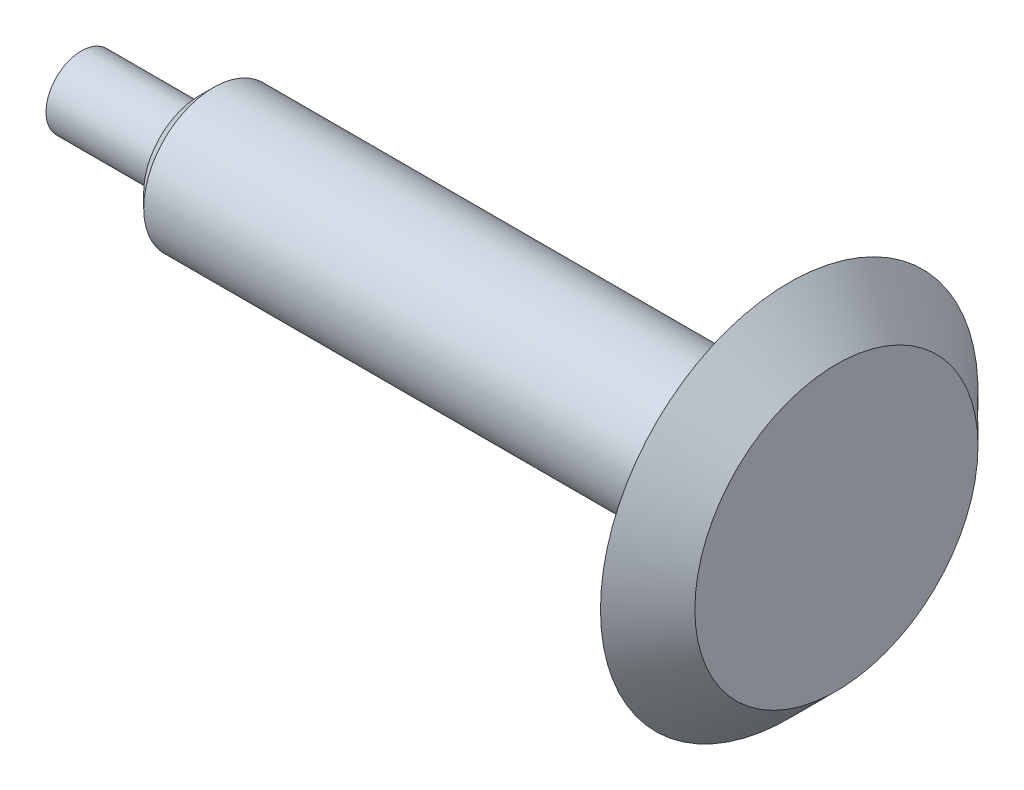
ISO-10303-21;
HEADER;
FILE_DESCRIPTION(('STEP AP214'),'2;1');
FILE_NAME('part.step','',(''),(''),'','','');
FILE_SCHEMA(('AUTOMOTIVE_DESIGN { 1 0 10303 214 1 1 1 1 }'));
ENDSEC;
DATA;
#1=APPLICATION_CONTEXT('core data for automotive mechanical design processes');
#2=APPLICATION_PROTOCOL_DEFINITION('international standard','automotive_design',2000,#1);
#3=PRODUCT_CONTEXT('',#1,'mechanical');
#4=PRODUCT('Part','Part','',(#3));
#5=PRODUCT_RELATED_PRODUCT_CATEGORY('part','',(#4));
#6=PRODUCT_DEFINITION_FORMATION('','',#4);
#7=PRODUCT_DEFINITION_CONTEXT('part definition',#1,'design');
#8=PRODUCT_DEFINITION('design','',#6,#7);
#9=PRODUCT_DEFINITION_SHAPE('','',#8);
#10=(LENGTH_UNIT() NAMED_UNIT(*) SI_UNIT(.MILLI.,.METRE.));
#11=(NAMED_UNIT(*) PLANE_ANGLE_UNIT() SI_UNIT($,.RADIAN.));
#12=(NAMED_UNIT(*) SI_UNIT($,.STERADIAN.) SOLID_ANGLE_UNIT());
#13=UNCERTAINTY_MEASURE_WITH_UNIT(LENGTH_MEASURE(1.E-05),#10,'distance_accuracy_value','');
#14=(GEOMETRIC_REPRESENTATION_CONTEXT(3) GLOBAL_UNCERTAINTY_ASSIGNED_CONTEXT((#13)) GLOBAL_UNIT_ASSIGNED_CONTEXT((#10,
#11,#12)) REPRESENTATION_CONTEXT('',''));
#15=CARTESIAN_POINT('',(0.,0.,0.));
#16=DIRECTION('',(0.,0.,1.));
#17=DIRECTION('',(1.,0.,0.));
#18=AXIS2_PLACEMENT_3D('',#15,#16,#17);
#19=CARTESIAN_POINT('',(-576.019001900249,0.,0.));
#20=DIRECTION('',(-1.,0.,0.));
#21=DIRECTION('',(0.,0.,1.));
#22=AXIS2_PLACEMENT_3D('',#19,#20,#21);
#23=CYLINDRICAL_SURFACE('',#22,147.955968353671);
#24=CARTESIAN_POINT('',(1033.52994323126,0.,0.));
#25=DIRECTION('',(-1.,0.,0.));
#26=DIRECTION('',(0.,0.,1.));
#27=AXIS2_PLACEMENT_3D('',#24,#25,#26);
#28=CIRCLE('',#27,147.955968353671);
#29=CARTESIAN_POINT('',(1033.52994323126,0.,147.955968353671));
#30=VERTEX_POINT('',#29);
#31=EDGE_CURVE('E10',#30,#30,#28,.T.);
#32=ORIENTED_EDGE('',*,*,#31,.T.);
#33=EDGE_LOOP('',(#32));
#34=FACE_BOUND('',#33,.T.);
#35=CARTESIAN_POINT('',(-86.4700567687408,0.,0.));
#36=DIRECTION('',(-1.,0.,0.));
#37=DIRECTION('',(0.,0.,1.));
#38=AXIS2_PLACEMENT_3D('',#35,#36,#37);
#39=CIRCLE('',#38,147.955968353671);
#40=CARTESIAN_POINT('',(-86.4700567687408,0.,147.955968353671));
#41=VERTEX_POINT('',#40);
#42=EDGE_CURVE('E72',#41,#41,#39,.T.);
#43=ORIENTED_EDGE('',*,*,#42,.F.);
#44=EDGE_LOOP('',(#43));
#45=FACE_BOUND('',#44,.T.);
#46=ADVANCED_FACE('F37',(#34,#45),#23,.T.);
#47=CARTESIAN_POINT('',(1033.52994323126,0.,0.));
#48=DIRECTION('',(1.,0.,0.));
#49=DIRECTION('',(0.,0.,-1.));
#50=AXIS2_PLACEMENT_3D('',#47,#48,#49);
#51=CONICAL_SURFACE('',#50,147.955968353671,0.785398163397452);
#52=CARTESIAN_POINT('',(1133.52994323126,0.,0.));
#53=DIRECTION('',(-1.,0.,0.));
#54=DIRECTION('',(0.,0.,1.));
#55=AXIS2_PLACEMENT_3D('',#52,#53,#54);
#56=CIRCLE('',#55,247.955968353672);
#57=CARTESIAN_POINT('',(1133.52994323126,0.,247.955968353672));
#58=VERTEX_POINT('',#57);
#59=EDGE_CURVE('E44',#58,#58,#56,.T.);
#60=ORIENTED_EDGE('',*,*,#59,.T.);
#61=EDGE_LOOP('',(#60));
#62=FACE_BOUND('',#61,.T.);
#63=ORIENTED_EDGE('',*,*,#31,.F.);
#64=EDGE_LOOP('',(#63));
#65=FACE_BOUND('',#64,.T.);
#66=ADVANCED_FACE('F81',(#62,#65),#51,.T.);
#67=CARTESIAN_POINT('',(1133.52994323126,0.,0.));
#68=DIRECTION('',(1.,0.,0.));
#69=DIRECTION('',(0.,0.,-1.));
#70=AXIS2_PLACEMENT_3D('',#67,#68,#69);
#71=PLANE('',#70);
#72=ORIENTED_EDGE('',*,*,#59,.F.);
#73=EDGE_LOOP('',(#72));
#74=FACE_BOUND('',#73,.T.);
#75=CARTESIAN_POINT('',(1133.52994323126,0.,0.));
#76=DIRECTION('',(-1.,0.,0.));
#77=DIRECTION('',(0.,0.,1.));
#78=AXIS2_PLACEMENT_3D('',#75,#76,#77);
#79=CIRCLE('',#78,400.);
#80=CARTESIAN_POINT('',(1133.52994323126,0.,400.));
#81=VERTEX_POINT('',#80);
#82=EDGE_CURVE('E49',#81,#81,#79,.T.);
#83=ORIENTED_EDGE('',*,*,#82,.T.);
#84=EDGE_LOOP('',(#83));
#85=FACE_BOUND('',#84,.T.);
#86=ADVANCED_FACE('F85',(#74,#85),#71,.F.);
#87=CARTESIAN_POINT('',(1133.52994323126,0.,0.));
#88=DIRECTION('',(-1.,0.,0.));
#89=DIRECTION('',(0.,0.,1.));
#90=AXIS2_PLACEMENT_3D('',#87,#88,#89);
#91=CONICAL_SURFACE('',#90,400.,0.785398163397445);
#92=CARTESIAN_POINT('',(1233.52994323126,0.,0.));
#93=DIRECTION('',(-1.,0.,0.));
#94=DIRECTION('',(0.,0.,1.));
#95=AXIS2_PLACEMENT_3D('',#92,#93,#94);
#96=CIRCLE('',#95,300.000000000001);
#97=CARTESIAN_POINT('',(1233.52994323126,0.,300.000000000001));
#98=VERTEX_POINT('',#97);
#99=EDGE_CURVE('E54',#98,#98,#96,.T.);
#100=ORIENTED_EDGE('',*,*,#99,.T.);
#101=EDGE_LOOP('',(#100));
#102=FACE_BOUND('',#101,.T.);
#103=ORIENTED_EDGE('',*,*,#82,.F.);
#104=EDGE_LOOP('',(#103));
#105=FACE_BOUND('',#104,.T.);
#106=ADVANCED_FACE('F89',(#102,#105),#91,.T.);
#107=CARTESIAN_POINT('',(1233.52994323126,0.,0.));
#108=DIRECTION('',(1.,0.,0.));
#109=DIRECTION('',(0.,0.,-1.));
#110=AXIS2_PLACEMENT_3D('',#107,#108,#109);
#111=PLANE('',#110);
#112=ORIENTED_EDGE('',*,*,#99,.F.);
#113=EDGE_LOOP('',(#112));
#114=FACE_BOUND('',#113,.T.);
#115=ADVANCED_FACE('F96',(#114),#111,.T.);
#116=CARTESIAN_POINT('',(-366.470056768741,0.,0.));
#117=DIRECTION('',(-1.,0.,0.));
#118=DIRECTION('',(0.,0.,1.));
#119=AXIS2_PLACEMENT_3D('',#116,#117,#118);
#120=PLANE('',#119);
#121=CARTESIAN_POINT('',(-366.470056768741,0.,0.));
#122=DIRECTION('',(-1.,0.,0.));
#123=DIRECTION('',(0.,0.,1.));
#124=AXIS2_PLACEMENT_3D('',#121,#122,#123);
#125=CIRCLE('',#124,75.);
#126=CARTESIAN_POINT('',(-366.470056768741,0.,75.));
#127=VERTEX_POINT('',#126);
#128=EDGE_CURVE('E60',#127,#127,#125,.T.);
#129=ORIENTED_EDGE('',*,*,#128,.T.);
#130=EDGE_LOOP('',(#129));
#131=FACE_BOUND('',#130,.T.);
#132=ADVANCED_FACE('F100',(#131),#120,.T.);
#133=CARTESIAN_POINT('',(-576.019001900249,0.,0.));
#134=DIRECTION('',(-1.,0.,0.));
#135=DIRECTION('',(0.,0.,1.));
#136=AXIS2_PLACEMENT_3D('',#133,#134,#135);
#137=CYLINDRICAL_SURFACE('',#136,75.);
#138=CARTESIAN_POINT('',(-116.470056768741,0.,0.));
#139=DIRECTION('',(-1.,0.,0.));
#140=DIRECTION('',(0.,0.,1.));
#141=AXIS2_PLACEMENT_3D('',#138,#139,#140);
#142=CIRCLE('',#141,75.);
#143=CARTESIAN_POINT('',(-116.470056768741,0.,75.));
#144=VERTEX_POINT('',#143);
#145=EDGE_CURVE('E64',#144,#144,#142,.T.);
#146=ORIENTED_EDGE('',*,*,#145,.T.);
#147=EDGE_LOOP('',(#146));
#148=FACE_BOUND('',#147,.T.);
#149=ORIENTED_EDGE('',*,*,#128,.F.);
#150=EDGE_LOOP('',(#149));
#151=FACE_BOUND('',#150,.T.);
#152=ADVANCED_FACE('F104',(#148,#151),#137,.T.);
#153=CARTESIAN_POINT('',(-116.470056768741,0.,0.));
#154=DIRECTION('',(1.,0.,0.));
#155=DIRECTION('',(0.,0.,-1.));
#156=AXIS2_PLACEMENT_3D('',#153,#154,#155);
#157=PLANE('',#156);
#158=ORIENTED_EDGE('',*,*,#145,.F.);
#159=EDGE_LOOP('',(#158));
#160=FACE_BOUND('',#159,.T.);
#161=CARTESIAN_POINT('',(-116.470056768741,0.,0.));
#162=DIRECTION('',(-1.,0.,0.));
#163=DIRECTION('',(0.,0.,1.));
#164=AXIS2_PLACEMENT_3D('',#161,#162,#163);
#165=CIRCLE('',#164,117.955968353671);
#166=CARTESIAN_POINT('',(-116.470056768741,0.,117.955968353671));
#167=VERTEX_POINT('',#166);
#168=EDGE_CURVE('E68',#167,#167,#165,.T.);
#169=ORIENTED_EDGE('',*,*,#168,.T.);
#170=EDGE_LOOP('',(#169));
#171=FACE_BOUND('',#170,.T.);
#172=ADVANCED_FACE('F108',(#160,#171),#157,.F.);
#173=CARTESIAN_POINT('',(-116.470056768741,0.,0.));
#174=DIRECTION('',(1.,0.,0.));
#175=DIRECTION('',(0.,0.,-1.));
#176=AXIS2_PLACEMENT_3D('',#173,#174,#175);
#177=CONICAL_SURFACE('',#176,117.955968353671,0.785398163397447);
#178=ORIENTED_EDGE('',*,*,#42,.T.);
#179=EDGE_LOOP('',(#178));
#180=FACE_BOUND('',#179,.T.);
#181=ORIENTED_EDGE('',*,*,#168,.F.);
#182=EDGE_LOOP('',(#181));
#183=FACE_BOUND('',#182,.T.);
#184=ADVANCED_FACE('F77',(#180,#183),#177,.T.);
#185=CLOSED_SHELL('',(#46,#66,#86,#106,#115,#132,#152,#172,#184));
#186=MANIFOLD_SOLID_BREP('B2',#185);
#187=ADVANCED_BREP_SHAPE_REPRESENTATION('',(#18,#186),#14);
#188=SHAPE_DEFINITION_REPRESENTATION(#9,#187);
ENDSEC;
END-ISO-10303-21;
